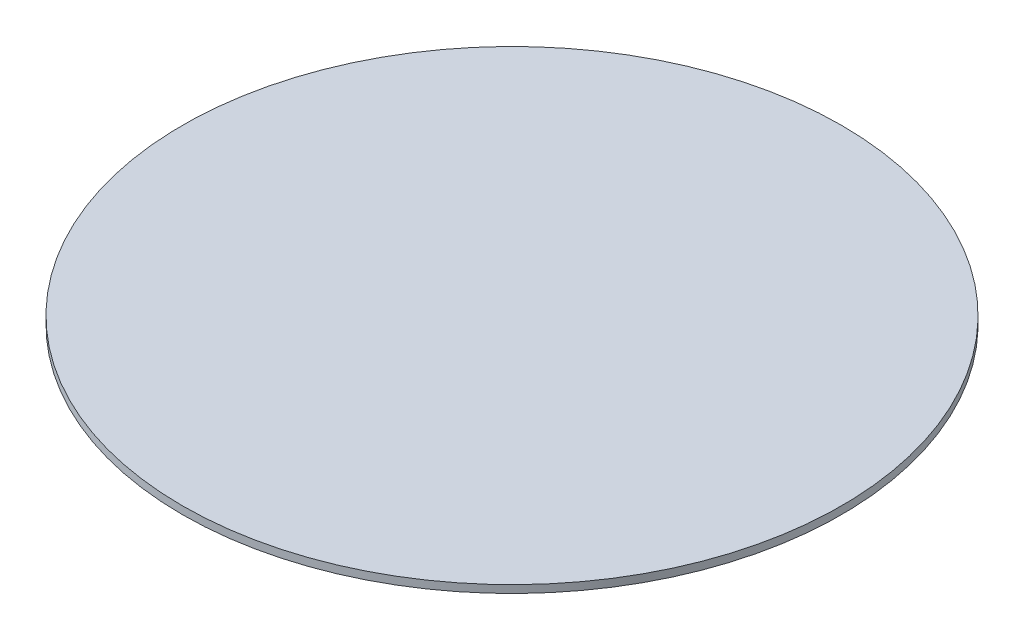
ISO-10303-21;
HEADER;
FILE_DESCRIPTION(('STEP AP214'),'2;1');
FILE_NAME('part.step','',(''),(''),'','','');
FILE_SCHEMA(('AUTOMOTIVE_DESIGN { 1 0 10303 214 1 1 1 1 }'));
ENDSEC;
DATA;
#1=APPLICATION_CONTEXT('core data for automotive mechanical design processes');
#2=APPLICATION_PROTOCOL_DEFINITION('international standard','automotive_design',2000,#1);
#3=PRODUCT_CONTEXT('',#1,'mechanical');
#4=PRODUCT('Part','Part','',(#3));
#5=PRODUCT_RELATED_PRODUCT_CATEGORY('part','',(#4));
#6=PRODUCT_DEFINITION_FORMATION('','',#4);
#7=PRODUCT_DEFINITION_CONTEXT('part definition',#1,'design');
#8=PRODUCT_DEFINITION('design','',#6,#7);
#9=PRODUCT_DEFINITION_SHAPE('','',#8);
#10=(LENGTH_UNIT() NAMED_UNIT(*) SI_UNIT(.MILLI.,.METRE.));
#11=(NAMED_UNIT(*) PLANE_ANGLE_UNIT() SI_UNIT($,.RADIAN.));
#12=(NAMED_UNIT(*) SI_UNIT($,.STERADIAN.) SOLID_ANGLE_UNIT());
#13=UNCERTAINTY_MEASURE_WITH_UNIT(LENGTH_MEASURE(1.E-05),#10,'distance_accuracy_value','');
#14=(GEOMETRIC_REPRESENTATION_CONTEXT(3) GLOBAL_UNCERTAINTY_ASSIGNED_CONTEXT((#13)) GLOBAL_UNIT_ASSIGNED_CONTEXT((#10,
#11,#12)) REPRESENTATION_CONTEXT('',''));
#15=CARTESIAN_POINT('',(0.,0.,0.));
#16=DIRECTION('',(0.,0.,1.));
#17=DIRECTION('',(1.,0.,0.));
#18=AXIS2_PLACEMENT_3D('',#15,#16,#17);
#19=CARTESIAN_POINT('',(0.,1.778,0.));
#20=DIRECTION('',(0.,-1.,0.));
#21=DIRECTION('',(0.,0.,-1.));
#22=AXIS2_PLACEMENT_3D('',#19,#20,#21);
#23=CYLINDRICAL_SURFACE('',#22,76.2);
#24=CARTESIAN_POINT('',(0.,1.778,0.));
#25=DIRECTION('',(0.,1.,0.));
#26=DIRECTION('',(0.,0.,1.));
#27=AXIS2_PLACEMENT_3D('',#24,#25,#26);
#28=CIRCLE('',#27,76.2);
#29=CARTESIAN_POINT('',(0.,1.778,76.2));
#30=VERTEX_POINT('',#29);
#31=EDGE_CURVE('E10',#30,#30,#28,.T.);
#32=ORIENTED_EDGE('',*,*,#31,.F.);
#33=EDGE_LOOP('',(#32));
#34=FACE_BOUND('',#33,.T.);
#35=CARTESIAN_POINT('',(0.,0.,0.));
#36=DIRECTION('',(0.,1.,0.));
#37=DIRECTION('',(0.,0.,1.));
#38=AXIS2_PLACEMENT_3D('',#35,#36,#37);
#39=CIRCLE('',#38,76.2);
#40=CARTESIAN_POINT('',(0.,0.,76.2));
#41=VERTEX_POINT('',#40);
#42=EDGE_CURVE('E34',#41,#41,#39,.T.);
#43=ORIENTED_EDGE('',*,*,#42,.T.);
#44=EDGE_LOOP('',(#43));
#45=FACE_BOUND('',#44,.T.);
#46=ADVANCED_FACE('F31',(#34,#45),#23,.T.);
#47=CARTESIAN_POINT('',(0.,1.778,0.));
#48=DIRECTION('',(0.,1.,0.));
#49=DIRECTION('',(0.,0.,1.));
#50=AXIS2_PLACEMENT_3D('',#47,#48,#49);
#51=PLANE('',#50);
#52=ORIENTED_EDGE('',*,*,#31,.T.);
#53=EDGE_LOOP('',(#52));
#54=FACE_BOUND('',#53,.T.);
#55=ADVANCED_FACE('F46',(#54),#51,.T.);
#56=CARTESIAN_POINT('',(0.,0.,0.));
#57=DIRECTION('',(0.,1.,0.));
#58=DIRECTION('',(0.,0.,1.));
#59=AXIS2_PLACEMENT_3D('',#56,#57,#58);
#60=PLANE('',#59);
#61=ORIENTED_EDGE('',*,*,#42,.F.);
#62=EDGE_LOOP('',(#61));
#63=FACE_BOUND('',#62,.T.);
#64=ADVANCED_FACE('F44',(#63),#60,.F.);
#65=CLOSED_SHELL('',(#46,#55,#64));
#66=MANIFOLD_SOLID_BREP('B2',#65);
#67=ADVANCED_BREP_SHAPE_REPRESENTATION('',(#18,#66),#14);
#68=SHAPE_DEFINITION_REPRESENTATION(#9,#67);
ENDSEC;
END-ISO-10303-21;
